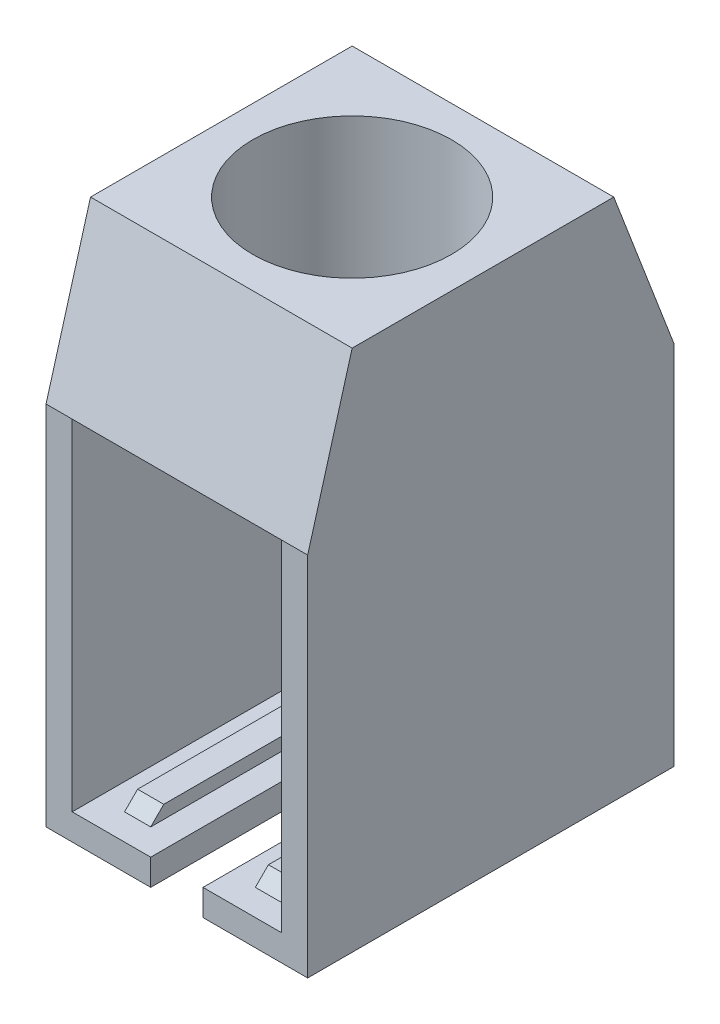
ISO-10303-21;
HEADER;
FILE_DESCRIPTION(('STEP AP214'),'2;1');
FILE_NAME('part.step','',(''),(''),'','','');
FILE_SCHEMA(('AUTOMOTIVE_DESIGN { 1 0 10303 214 1 1 1 1 }'));
ENDSEC;
DATA;
#1=APPLICATION_CONTEXT('core data for automotive mechanical design processes');
#2=APPLICATION_PROTOCOL_DEFINITION('international standard','automotive_design',2000,#1);
#3=PRODUCT_CONTEXT('',#1,'mechanical');
#4=PRODUCT('Part','Part','',(#3));
#5=PRODUCT_RELATED_PRODUCT_CATEGORY('part','',(#4));
#6=PRODUCT_DEFINITION_FORMATION('','',#4);
#7=PRODUCT_DEFINITION_CONTEXT('part definition',#1,'design');
#8=PRODUCT_DEFINITION('design','',#6,#7);
#9=PRODUCT_DEFINITION_SHAPE('','',#8);
#10=(LENGTH_UNIT() NAMED_UNIT(*) SI_UNIT(.MILLI.,.METRE.));
#11=(NAMED_UNIT(*) PLANE_ANGLE_UNIT() SI_UNIT($,.RADIAN.));
#12=(NAMED_UNIT(*) SI_UNIT($,.STERADIAN.) SOLID_ANGLE_UNIT());
#13=UNCERTAINTY_MEASURE_WITH_UNIT(LENGTH_MEASURE(1.E-05),#10,'distance_accuracy_value','');
#14=(GEOMETRIC_REPRESENTATION_CONTEXT(3) GLOBAL_UNCERTAINTY_ASSIGNED_CONTEXT((#13)) GLOBAL_UNIT_ASSIGNED_CONTEXT((#10,
#11,#12)) REPRESENTATION_CONTEXT('',''));
#15=CARTESIAN_POINT('',(0.,0.,0.));
#16=DIRECTION('',(0.,0.,1.));
#17=DIRECTION('',(1.,0.,0.));
#18=AXIS2_PLACEMENT_3D('',#15,#16,#17);
#19=CARTESIAN_POINT('',(2.5,10.,3.5));
#20=DIRECTION('',(0.,0.,-1.));
#21=DIRECTION('',(-1.,0.,0.));
#22=AXIS2_PLACEMENT_3D('',#19,#20,#21);
#23=PLANE('',#22);
#24=DIRECTION('',(0.,-1.,0.));
#25=VECTOR('',#24,1.);
#26=CARTESIAN_POINT('',(-2.,6.5,3.5));
#27=LINE('',#26,#25);
#28=CARTESIAN_POINT('',(-2.,7.,3.5));
#29=VERTEX_POINT('',#28);
#30=CARTESIAN_POINT('',(-2.,0.5,3.5));
#31=VERTEX_POINT('',#30);
#32=EDGE_CURVE('E68',#29,#31,#27,.T.);
#33=ORIENTED_EDGE('',*,*,#32,.F.);
#34=DIRECTION('',(1.,0.,0.));
#35=VECTOR('',#34,1.);
#36=CARTESIAN_POINT('',(-2.5,7.,3.5));
#37=LINE('',#36,#35);
#38=CARTESIAN_POINT('',(-2.5,7.,3.5));
#39=VERTEX_POINT('',#38);
#40=EDGE_CURVE('E331',#39,#29,#37,.T.);
#41=ORIENTED_EDGE('',*,*,#40,.F.);
#42=DIRECTION('',(0.,-1.,0.));
#43=VECTOR('',#42,1.);
#44=CARTESIAN_POINT('',(-2.5,10.,3.5));
#45=LINE('',#44,#43);
#46=CARTESIAN_POINT('',(-2.5,0.,3.5));
#47=VERTEX_POINT('',#46);
#48=EDGE_CURVE('E368',#39,#47,#45,.T.);
#49=ORIENTED_EDGE('',*,*,#48,.T.);
#50=DIRECTION('',(1.,0.,0.));
#51=VECTOR('',#50,1.);
#52=CARTESIAN_POINT('',(2.5,0.,3.5));
#53=LINE('',#52,#51);
#54=CARTESIAN_POINT('',(-0.5,0.,3.5));
#55=VERTEX_POINT('',#54);
#56=EDGE_CURVE('E354',#47,#55,#53,.T.);
#57=ORIENTED_EDGE('',*,*,#56,.T.);
#58=DIRECTION('',(0.,-1.,0.));
#59=VECTOR('',#58,1.);
#60=CARTESIAN_POINT('',(-0.5,10.001,3.5));
#61=LINE('',#60,#59);
#62=CARTESIAN_POINT('',(-0.5,0.5,3.5));
#63=VERTEX_POINT('',#62);
#64=EDGE_CURVE('E263',#63,#55,#61,.T.);
#65=ORIENTED_EDGE('',*,*,#64,.F.);
#66=DIRECTION('',(1.,0.,0.));
#67=VECTOR('',#66,1.);
#68=CARTESIAN_POINT('',(-2.,0.5,3.5));
#69=LINE('',#68,#67);
#70=EDGE_CURVE('E306',#31,#63,#69,.T.);
#71=ORIENTED_EDGE('',*,*,#70,.F.);
#72=EDGE_LOOP('',(#33,#41,#49,#57,#65,#71));
#73=FACE_BOUND('',#72,.T.);
#74=ADVANCED_FACE('F45',(#73),#23,.F.);
#75=CARTESIAN_POINT('',(-2.,0.5,-10.711102550928));
#76=DIRECTION('',(0.,-1.,0.));
#77=DIRECTION('',(0.,0.,-1.));
#78=AXIS2_PLACEMENT_3D('',#75,#76,#77);
#79=PLANE('',#78);
#80=DIRECTION('',(-1.,0.,0.));
#81=VECTOR('',#80,1.);
#82=CARTESIAN_POINT('',(-2.,0.5,-3.));
#83=LINE('',#82,#81);
#84=CARTESIAN_POINT('',(2.,0.5,-3.));
#85=VERTEX_POINT('',#84);
#86=CARTESIAN_POINT('',(1.5,0.5,-3.));
#87=VERTEX_POINT('',#86);
#88=EDGE_CURVE('E297',#85,#87,#83,.T.);
#89=ORIENTED_EDGE('',*,*,#88,.T.);
#90=DIRECTION('',(0.,0.,1.));
#91=VECTOR('',#90,1.);
#92=CARTESIAN_POINT('',(1.5,0.5,0.));
#93=LINE('',#92,#91);
#94=CARTESIAN_POINT('',(1.5,0.5,3.));
#95=VERTEX_POINT('',#94);
#96=EDGE_CURVE('E234',#87,#95,#93,.T.);
#97=ORIENTED_EDGE('',*,*,#96,.T.);
#98=DIRECTION('',(1.,0.,0.));
#99=VECTOR('',#98,1.);
#100=CARTESIAN_POINT('',(0.,0.5,3.));
#101=LINE('',#100,#99);
#102=CARTESIAN_POINT('',(0.999999999999999,0.5,3.));
#103=VERTEX_POINT('',#102);
#104=EDGE_CURVE('E231',#103,#95,#101,.T.);
#105=ORIENTED_EDGE('',*,*,#104,.F.);
#106=DIRECTION('',(0.,0.,1.));
#107=VECTOR('',#106,1.);
#108=CARTESIAN_POINT('',(0.999999999999999,0.5,0.));
#109=LINE('',#108,#107);
#110=CARTESIAN_POINT('',(0.999999999999999,0.5,-3.));
#111=VERTEX_POINT('',#110);
#112=EDGE_CURVE('E237',#111,#103,#109,.T.);
#113=ORIENTED_EDGE('',*,*,#112,.F.);
#114=CARTESIAN_POINT('',(-0.999999999999999,0.5,-3.));
#115=VERTEX_POINT('',#114);
#116=EDGE_CURVE('E209',#111,#115,#83,.T.);
#117=ORIENTED_EDGE('',*,*,#116,.T.);
#118=DIRECTION('',(0.,0.,1.));
#119=VECTOR('',#118,1.);
#120=CARTESIAN_POINT('',(-0.999999999999999,0.5,0.));
#121=LINE('',#120,#119);
#122=CARTESIAN_POINT('',(-1.,0.5,3.));
#123=VERTEX_POINT('',#122);
#124=EDGE_CURVE('E245',#115,#123,#121,.T.);
#125=ORIENTED_EDGE('',*,*,#124,.T.);
#126=DIRECTION('',(1.,0.,0.));
#127=VECTOR('',#126,1.);
#128=CARTESIAN_POINT('',(0.,0.5,3.00000000000003));
#129=LINE('',#128,#127);
#130=CARTESIAN_POINT('',(-1.5,0.5,2.99999999999999));
#131=VERTEX_POINT('',#130);
#132=EDGE_CURVE('E254',#131,#123,#129,.T.);
#133=ORIENTED_EDGE('',*,*,#132,.F.);
#134=DIRECTION('',(0.,0.,1.));
#135=VECTOR('',#134,1.);
#136=CARTESIAN_POINT('',(-1.5,0.5,0.));
#137=LINE('',#136,#135);
#138=CARTESIAN_POINT('',(-1.5,0.5,-3.));
#139=VERTEX_POINT('',#138);
#140=EDGE_CURVE('E240',#139,#131,#137,.T.);
#141=ORIENTED_EDGE('',*,*,#140,.F.);
#142=CARTESIAN_POINT('',(-2.,0.5,-3.));
#143=VERTEX_POINT('',#142);
#144=EDGE_CURVE('E295',#139,#143,#83,.T.);
#145=ORIENTED_EDGE('',*,*,#144,.T.);
#146=DIRECTION('',(0.,0.,1.));
#147=VECTOR('',#146,1.);
#148=CARTESIAN_POINT('',(-2.,0.5,-10.711102550928));
#149=LINE('',#148,#147);
#150=EDGE_CURVE('E311',#143,#31,#149,.T.);
#151=ORIENTED_EDGE('',*,*,#150,.T.);
#152=ORIENTED_EDGE('',*,*,#70,.T.);
#153=DIRECTION('',(0.,0.,1.));
#154=VECTOR('',#153,1.);
#155=CARTESIAN_POINT('',(-0.5,0.5,3.5));
#156=LINE('',#155,#154);
#157=CARTESIAN_POINT('',(-0.5,0.5,0.149999999999999));
#158=VERTEX_POINT('',#157);
#159=EDGE_CURVE('E264',#158,#63,#156,.T.);
#160=ORIENTED_EDGE('',*,*,#159,.F.);
#161=CARTESIAN_POINT('',(0.,0.5,0.15));
#162=DIRECTION('',(0.,-1.,0.));
#163=DIRECTION('',(0.,0.,-1.));
#164=AXIS2_PLACEMENT_3D('',#161,#162,#163);
#165=CIRCLE('',#164,0.5);
#166=CARTESIAN_POINT('',(0.5,0.5,0.15));
#167=VERTEX_POINT('',#166);
#168=EDGE_CURVE('E267',#167,#158,#165,.F.);
#169=ORIENTED_EDGE('',*,*,#168,.F.);
#170=DIRECTION('',(0.,0.,-1.));
#171=VECTOR('',#170,1.);
#172=CARTESIAN_POINT('',(0.5,0.5,0.15));
#173=LINE('',#172,#171);
#174=CARTESIAN_POINT('',(0.5,0.5,3.5));
#175=VERTEX_POINT('',#174);
#176=EDGE_CURVE('E276',#175,#167,#173,.T.);
#177=ORIENTED_EDGE('',*,*,#176,.F.);
#178=CARTESIAN_POINT('',(2.,0.5,3.5));
#179=VERTEX_POINT('',#178);
#180=EDGE_CURVE('E305',#175,#179,#69,.T.);
#181=ORIENTED_EDGE('',*,*,#180,.T.);
#182=DIRECTION('',(0.,0.,1.));
#183=VECTOR('',#182,1.);
#184=CARTESIAN_POINT('',(2.,0.5,-10.711102550928));
#185=LINE('',#184,#183);
#186=EDGE_CURVE('E296',#85,#179,#185,.T.);
#187=ORIENTED_EDGE('',*,*,#186,.F.);
#188=EDGE_LOOP('',(#89,#97,#105,#113,#117,#125,#133,#141,#145,#151,#152,#160,#169,#177,#181,#187));
#189=FACE_BOUND('',#188,.T.);
#190=ADVANCED_FACE('F437',(#189),#79,.F.);
#191=CARTESIAN_POINT('',(2.5,10.,-3.));
#192=DIRECTION('',(0.,0.,1.));
#193=DIRECTION('',(1.,0.,0.));
#194=AXIS2_PLACEMENT_3D('',#191,#192,#193);
#195=PLANE('',#194);
#196=DIRECTION('',(0.,-1.,0.));
#197=VECTOR('',#196,1.);
#198=CARTESIAN_POINT('',(1.5,0.75,-3.));
#199=LINE('',#198,#197);
#200=CARTESIAN_POINT('',(1.5,0.750000000000001,-3.));
#201=VERTEX_POINT('',#200);
#202=EDGE_CURVE('E213',#201,#87,#199,.T.);
#203=ORIENTED_EDGE('',*,*,#202,.T.);
#204=ORIENTED_EDGE('',*,*,#88,.F.);
#205=DIRECTION('',(0.,-1.,0.));
#206=VECTOR('',#205,1.);
#207=CARTESIAN_POINT('',(2.,6.5,-3.));
#208=LINE('',#207,#206);
#209=CARTESIAN_POINT('',(2.,6.5,-3.));
#210=VERTEX_POINT('',#209);
#211=EDGE_CURVE('E300',#210,#85,#208,.T.);
#212=ORIENTED_EDGE('',*,*,#211,.F.);
#213=DIRECTION('',(1.,0.,0.));
#214=VECTOR('',#213,1.);
#215=CARTESIAN_POINT('',(-2.,6.5,-3.));
#216=LINE('',#215,#214);
#217=CARTESIAN_POINT('',(-2.,6.5,-3.));
#218=VERTEX_POINT('',#217);
#219=EDGE_CURVE('E302',#218,#210,#216,.T.);
#220=ORIENTED_EDGE('',*,*,#219,.F.);
#221=DIRECTION('',(0.,1.,0.));
#222=VECTOR('',#221,1.);
#223=CARTESIAN_POINT('',(-2.,6.5,-3.));
#224=LINE('',#223,#222);
#225=EDGE_CURVE('E293',#143,#218,#224,.T.);
#226=ORIENTED_EDGE('',*,*,#225,.F.);
#227=ORIENTED_EDGE('',*,*,#144,.F.);
#228=DIRECTION('',(0.,-1.,0.));
#229=VECTOR('',#228,1.);
#230=CARTESIAN_POINT('',(-1.5,0.75,-3.));
#231=LINE('',#230,#229);
#232=CARTESIAN_POINT('',(-1.5,0.75,-3.));
#233=VERTEX_POINT('',#232);
#234=EDGE_CURVE('E251',#233,#139,#231,.T.);
#235=ORIENTED_EDGE('',*,*,#234,.F.);
#236=DIRECTION('',(-1.,0.,0.));
#237=VECTOR('',#236,1.);
#238=CARTESIAN_POINT('',(0.,0.75,-3.));
#239=LINE('',#238,#237);
#240=CARTESIAN_POINT('',(-0.999999999999999,0.750000000000001,-3.));
#241=VERTEX_POINT('',#240);
#242=EDGE_CURVE('E248',#241,#233,#239,.T.);
#243=ORIENTED_EDGE('',*,*,#242,.F.);
#244=DIRECTION('',(0.,-1.,0.));
#245=VECTOR('',#244,1.);
#246=CARTESIAN_POINT('',(-0.999999999999999,0.75,-3.));
#247=LINE('',#246,#245);
#248=EDGE_CURVE('E261',#241,#115,#247,.T.);
#249=ORIENTED_EDGE('',*,*,#248,.T.);
#250=ORIENTED_EDGE('',*,*,#116,.F.);
#251=DIRECTION('',(0.,-1.,0.));
#252=VECTOR('',#251,1.);
#253=CARTESIAN_POINT('',(0.999999999999999,0.75,-3.));
#254=LINE('',#253,#252);
#255=CARTESIAN_POINT('',(0.999999999999999,0.75,-3.));
#256=VERTEX_POINT('',#255);
#257=EDGE_CURVE('E203',#256,#111,#254,.T.);
#258=ORIENTED_EDGE('',*,*,#257,.F.);
#259=DIRECTION('',(-1.,0.,0.));
#260=VECTOR('',#259,1.);
#261=CARTESIAN_POINT('',(0.,0.75,-3.));
#262=LINE('',#261,#260);
#263=EDGE_CURVE('E206',#201,#256,#262,.T.);
#264=ORIENTED_EDGE('',*,*,#263,.F.);
#265=EDGE_LOOP('',(#203,#204,#212,#220,#226,#227,#235,#243,#249,#250,#258,#264));
#266=FACE_BOUND('',#265,.T.);
#267=ADVANCED_FACE('F205',(#266),#195,.T.);
#268=CARTESIAN_POINT('',(-2.5,10.,-3.5));
#269=DIRECTION('',(1.,0.,0.));
#270=DIRECTION('',(0.,0.,-1.));
#271=AXIS2_PLACEMENT_3D('',#268,#269,#270);
#272=PLANE('',#271);
#273=ORIENTED_EDGE('',*,*,#48,.F.);
#274=DIRECTION('',(0.,0.962126726315384,-0.272602572456025));
#275=VECTOR('',#274,1.);
#276=CARTESIAN_POINT('',(-2.5,7.,3.5));
#277=LINE('',#276,#275);
#278=CARTESIAN_POINT('',(-2.5,10.,2.65));
#279=VERTEX_POINT('',#278);
#280=EDGE_CURVE('E320',#39,#279,#277,.T.);
#281=ORIENTED_EDGE('',*,*,#280,.T.);
#282=DIRECTION('',(0.,0.,1.));
#283=VECTOR('',#282,1.);
#284=CARTESIAN_POINT('',(-2.5,10.,-3.5));
#285=LINE('',#284,#283);
#286=CARTESIAN_POINT('',(-2.5,10.,-2.35));
#287=VERTEX_POINT('',#286);
#288=EDGE_CURVE('E343',#287,#279,#285,.T.);
#289=ORIENTED_EDGE('',*,*,#288,.F.);
#290=DIRECTION('',(0.,-0.93374611730205,-0.357936011632452));
#291=VECTOR('',#290,1.);
#292=CARTESIAN_POINT('',(-2.5,7.,-3.5));
#293=LINE('',#292,#291);
#294=CARTESIAN_POINT('',(-2.5,7.,-3.5));
#295=VERTEX_POINT('',#294);
#296=EDGE_CURVE('E338',#287,#295,#293,.T.);
#297=ORIENTED_EDGE('',*,*,#296,.T.);
#298=DIRECTION('',(0.,-1.,0.));
#299=VECTOR('',#298,1.);
#300=CARTESIAN_POINT('',(-2.5,10.,-3.5));
#301=LINE('',#300,#299);
#302=CARTESIAN_POINT('',(-2.5,0.,-3.5));
#303=VERTEX_POINT('',#302);
#304=EDGE_CURVE('E350',#295,#303,#301,.T.);
#305=ORIENTED_EDGE('',*,*,#304,.T.);
#306=DIRECTION('',(0.,0.,1.));
#307=VECTOR('',#306,1.);
#308=CARTESIAN_POINT('',(-2.5,0.,-3.5));
#309=LINE('',#308,#307);
#310=EDGE_CURVE('E330',#303,#47,#309,.T.);
#311=ORIENTED_EDGE('',*,*,#310,.T.);
#312=EDGE_LOOP('',(#273,#281,#289,#297,#305,#311));
#313=FACE_BOUND('',#312,.T.);
#314=ADVANCED_FACE('F422',(#313),#272,.F.);
#315=CARTESIAN_POINT('',(2.,7.,3.5));
#316=VERTEX_POINT('',#315);
#317=CARTESIAN_POINT('',(2.5,7.,3.5));
#318=VERTEX_POINT('',#317);
#319=EDGE_CURVE('E323',#316,#318,#37,.T.);
#320=ORIENTED_EDGE('',*,*,#319,.F.);
#321=DIRECTION('',(0.,1.,0.));
#322=VECTOR('',#321,1.);
#323=CARTESIAN_POINT('',(2.,6.5,3.5));
#324=LINE('',#323,#322);
#325=EDGE_CURVE('E60',#179,#316,#324,.T.);
#326=ORIENTED_EDGE('',*,*,#325,.F.);
#327=ORIENTED_EDGE('',*,*,#180,.F.);
#328=DIRECTION('',(0.,-1.,0.));
#329=VECTOR('',#328,1.);
#330=CARTESIAN_POINT('',(0.5,10.001,3.5));
#331=LINE('',#330,#329);
#332=CARTESIAN_POINT('',(0.5,0.,3.5));
#333=VERTEX_POINT('',#332);
#334=EDGE_CURVE('E273',#175,#333,#331,.T.);
#335=ORIENTED_EDGE('',*,*,#334,.T.);
#336=CARTESIAN_POINT('',(2.5,0.,3.5));
#337=VERTEX_POINT('',#336);
#338=EDGE_CURVE('E353',#333,#337,#53,.T.);
#339=ORIENTED_EDGE('',*,*,#338,.T.);
#340=DIRECTION('',(0.,-1.,0.));
#341=VECTOR('',#340,1.);
#342=CARTESIAN_POINT('',(2.5,10.,3.5));
#343=LINE('',#342,#341);
#344=EDGE_CURVE('E365',#318,#337,#343,.T.);
#345=ORIENTED_EDGE('',*,*,#344,.F.);
#346=EDGE_LOOP('',(#320,#326,#327,#335,#339,#345));
#347=FACE_BOUND('',#346,.T.);
#348=ADVANCED_FACE('F404',(#347),#23,.F.);
#349=CARTESIAN_POINT('',(2.5,10.,-3.5));
#350=DIRECTION('',(-1.,0.,0.));
#351=DIRECTION('',(0.,0.,1.));
#352=AXIS2_PLACEMENT_3D('',#349,#350,#351);
#353=PLANE('',#352);
#354=DIRECTION('',(0.,0.,-1.));
#355=VECTOR('',#354,1.);
#356=CARTESIAN_POINT('',(2.5,10.,-3.5));
#357=LINE('',#356,#355);
#358=CARTESIAN_POINT('',(2.5,10.,2.65));
#359=VERTEX_POINT('',#358);
#360=CARTESIAN_POINT('',(2.5,10.,-2.35));
#361=VERTEX_POINT('',#360);
#362=EDGE_CURVE('E346',#359,#361,#357,.T.);
#363=ORIENTED_EDGE('',*,*,#362,.F.);
#364=DIRECTION('',(0.,0.962126726315384,-0.272602572456025));
#365=VECTOR('',#364,1.);
#366=CARTESIAN_POINT('',(2.5,7.,3.5));
#367=LINE('',#366,#365);
#368=EDGE_CURVE('E324',#318,#359,#367,.T.);
#369=ORIENTED_EDGE('',*,*,#368,.F.);
#370=ORIENTED_EDGE('',*,*,#344,.T.);
#371=DIRECTION('',(0.,0.,-1.));
#372=VECTOR('',#371,1.);
#373=CARTESIAN_POINT('',(2.5,0.,-3.5));
#374=LINE('',#373,#372);
#375=CARTESIAN_POINT('',(2.5,0.,-3.5));
#376=VERTEX_POINT('',#375);
#377=EDGE_CURVE('E357',#337,#376,#374,.T.);
#378=ORIENTED_EDGE('',*,*,#377,.T.);
#379=DIRECTION('',(0.,-1.,0.));
#380=VECTOR('',#379,1.);
#381=CARTESIAN_POINT('',(2.5,10.,-3.5));
#382=LINE('',#381,#380);
#383=CARTESIAN_POINT('',(2.5,7.,-3.5));
#384=VERTEX_POINT('',#383);
#385=EDGE_CURVE('E363',#384,#376,#382,.T.);
#386=ORIENTED_EDGE('',*,*,#385,.F.);
#387=DIRECTION('',(0.,-0.93374611730205,-0.357936011632452));
#388=VECTOR('',#387,1.);
#389=CARTESIAN_POINT('',(2.5,7.,-3.5));
#390=LINE('',#389,#388);
#391=EDGE_CURVE('E326',#361,#384,#390,.T.);
#392=ORIENTED_EDGE('',*,*,#391,.F.);
#393=EDGE_LOOP('',(#363,#369,#370,#378,#386,#392));
#394=FACE_BOUND('',#393,.T.);
#395=ADVANCED_FACE('F401',(#394),#353,.F.);
#396=CARTESIAN_POINT('',(2.5,10.,-3.5));
#397=DIRECTION('',(0.,0.,1.));
#398=DIRECTION('',(1.,0.,0.));
#399=AXIS2_PLACEMENT_3D('',#396,#397,#398);
#400=PLANE('',#399);
#401=ORIENTED_EDGE('',*,*,#304,.F.);
#402=DIRECTION('',(1.,0.,0.));
#403=VECTOR('',#402,1.);
#404=CARTESIAN_POINT('',(-2.5,7.,-3.5));
#405=LINE('',#404,#403);
#406=EDGE_CURVE('E335',#295,#384,#405,.T.);
#407=ORIENTED_EDGE('',*,*,#406,.T.);
#408=ORIENTED_EDGE('',*,*,#385,.T.);
#409=DIRECTION('',(-1.,0.,0.));
#410=VECTOR('',#409,1.);
#411=CARTESIAN_POINT('',(2.5,0.,-3.5));
#412=LINE('',#411,#410);
#413=EDGE_CURVE('E347',#376,#303,#412,.T.);
#414=ORIENTED_EDGE('',*,*,#413,.T.);
#415=EDGE_LOOP('',(#401,#407,#408,#414));
#416=FACE_BOUND('',#415,.T.);
#417=ADVANCED_FACE('F416',(#416),#400,.F.);
#418=CARTESIAN_POINT('',(0.,10.,0.));
#419=DIRECTION('',(0.,-1.,0.));
#420=DIRECTION('',(0.,0.,-1.));
#421=AXIS2_PLACEMENT_3D('',#418,#419,#420);
#422=PLANE('',#421);
#423=CARTESIAN_POINT('',(0.,10.,0.15));
#424=DIRECTION('',(0.,1.,0.));
#425=DIRECTION('',(0.,0.,1.));
#426=AXIS2_PLACEMENT_3D('',#423,#424,#425);
#427=CIRCLE('',#426,1.9);
#428=CARTESIAN_POINT('',(0.,10.,2.05));
#429=VERTEX_POINT('',#428);
#430=EDGE_CURVE('E290',#429,#429,#427,.T.);
#431=ORIENTED_EDGE('',*,*,#430,.F.);
#432=EDGE_LOOP('',(#431));
#433=FACE_BOUND('',#432,.T.);
#434=ORIENTED_EDGE('',*,*,#288,.T.);
#435=DIRECTION('',(1.,0.,0.));
#436=VECTOR('',#435,1.);
#437=CARTESIAN_POINT('',(-2.5,10.,2.65));
#438=LINE('',#437,#436);
#439=EDGE_CURVE('E327',#279,#359,#438,.T.);
#440=ORIENTED_EDGE('',*,*,#439,.T.);
#441=ORIENTED_EDGE('',*,*,#362,.T.);
#442=DIRECTION('',(1.,0.,0.));
#443=VECTOR('',#442,1.);
#444=CARTESIAN_POINT('',(-2.5,10.,-2.35));
#445=LINE('',#444,#443);
#446=EDGE_CURVE('E319',#287,#361,#445,.T.);
#447=ORIENTED_EDGE('',*,*,#446,.F.);
#448=EDGE_LOOP('',(#434,#440,#441,#447));
#449=FACE_BOUND('',#448,.T.);
#450=ADVANCED_FACE('F424',(#433,#449),#422,.F.);
#451=CARTESIAN_POINT('',(0.,0.,0.));
#452=DIRECTION('',(0.,-1.,0.));
#453=DIRECTION('',(0.,0.,-1.));
#454=AXIS2_PLACEMENT_3D('',#451,#452,#453);
#455=PLANE('',#454);
#456=DIRECTION('',(0.,0.,1.));
#457=VECTOR('',#456,1.);
#458=CARTESIAN_POINT('',(0.5,0.,0.15));
#459=LINE('',#458,#457);
#460=CARTESIAN_POINT('',(0.5,0.,0.15));
#461=VERTEX_POINT('',#460);
#462=EDGE_CURVE('E274',#461,#333,#459,.T.);
#463=ORIENTED_EDGE('',*,*,#462,.F.);
#464=CARTESIAN_POINT('',(0.,0.,0.15));
#465=DIRECTION('',(0.,-1.,0.));
#466=DIRECTION('',(0.,0.,-1.));
#467=AXIS2_PLACEMENT_3D('',#464,#465,#466);
#468=CIRCLE('',#467,0.5);
#469=CARTESIAN_POINT('',(-0.5,0.,0.15));
#470=VERTEX_POINT('',#469);
#471=EDGE_CURVE('E277',#470,#461,#468,.T.);
#472=ORIENTED_EDGE('',*,*,#471,.F.);
#473=DIRECTION('',(0.,0.,-1.));
#474=VECTOR('',#473,1.);
#475=CARTESIAN_POINT('',(-0.5,0.,3.5));
#476=LINE('',#475,#474);
#477=EDGE_CURVE('E270',#55,#470,#476,.T.);
#478=ORIENTED_EDGE('',*,*,#477,.F.);
#479=ORIENTED_EDGE('',*,*,#56,.F.);
#480=ORIENTED_EDGE('',*,*,#310,.F.);
#481=ORIENTED_EDGE('',*,*,#413,.F.);
#482=ORIENTED_EDGE('',*,*,#377,.F.);
#483=ORIENTED_EDGE('',*,*,#338,.F.);
#484=EDGE_LOOP('',(#463,#472,#478,#479,#480,#481,#482,#483));
#485=FACE_BOUND('',#484,.T.);
#486=ADVANCED_FACE('F409',(#485),#455,.T.);
#487=CARTESIAN_POINT('',(-2.5,7.,-3.5));
#488=DIRECTION('',(0.,-0.357936011632452,0.93374611730205));
#489=DIRECTION('',(0.,-0.93374611730205,-0.357936011632452));
#490=AXIS2_PLACEMENT_3D('',#487,#488,#489);
#491=PLANE('',#490);
#492=ORIENTED_EDGE('',*,*,#391,.T.);
#493=ORIENTED_EDGE('',*,*,#406,.F.);
#494=ORIENTED_EDGE('',*,*,#296,.F.);
#495=ORIENTED_EDGE('',*,*,#446,.T.);
#496=EDGE_LOOP('',(#492,#493,#494,#495));
#497=FACE_BOUND('',#496,.T.);
#498=ADVANCED_FACE('F418',(#497),#491,.F.);
#499=CARTESIAN_POINT('',(-2.5,7.,3.5));
#500=DIRECTION('',(0.,-0.272602572456025,-0.962126726315384));
#501=DIRECTION('',(0.,0.962126726315384,-0.272602572456025));
#502=AXIS2_PLACEMENT_3D('',#499,#500,#501);
#503=PLANE('',#502);
#504=ORIENTED_EDGE('',*,*,#368,.T.);
#505=ORIENTED_EDGE('',*,*,#439,.F.);
#506=ORIENTED_EDGE('',*,*,#280,.F.);
#507=ORIENTED_EDGE('',*,*,#40,.T.);
#508=EDGE_CURVE('E334',#29,#316,#37,.T.);
#509=ORIENTED_EDGE('',*,*,#508,.T.);
#510=ORIENTED_EDGE('',*,*,#319,.T.);
#511=EDGE_LOOP('',(#504,#505,#506,#507,#509,#510));
#512=FACE_BOUND('',#511,.T.);
#513=ADVANCED_FACE('F393',(#512),#503,.F.);
#514=CARTESIAN_POINT('',(2.,6.5,-10.711102550928));
#515=DIRECTION('',(1.,0.,0.));
#516=DIRECTION('',(0.,0.,-1.));
#517=AXIS2_PLACEMENT_3D('',#514,#515,#516);
#518=PLANE('',#517);
#519=ORIENTED_EDGE('',*,*,#211,.T.);
#520=ORIENTED_EDGE('',*,*,#186,.T.);
#521=ORIENTED_EDGE('',*,*,#325,.T.);
#522=DIRECTION('',(0.,0.707106781186547,0.707106781186548));
#523=VECTOR('',#522,1.);
#524=CARTESIAN_POINT('',(2.,-0.355551275463988,-3.855551275464));
#525=LINE('',#524,#523);
#526=CARTESIAN_POINT('',(2.,6.5,3.));
#527=VERTEX_POINT('',#526);
#528=EDGE_CURVE('E12',#316,#527,#525,.F.);
#529=ORIENTED_EDGE('',*,*,#528,.T.);
#530=DIRECTION('',(0.,0.,1.));
#531=VECTOR('',#530,1.);
#532=CARTESIAN_POINT('',(2.,6.5,-10.711102550928));
#533=LINE('',#532,#531);
#534=EDGE_CURVE('E309',#210,#527,#533,.T.);
#535=ORIENTED_EDGE('',*,*,#534,.F.);
#536=EDGE_LOOP('',(#519,#520,#521,#529,#535));
#537=FACE_BOUND('',#536,.T.);
#538=ADVANCED_FACE('F490',(#537),#518,.F.);
#539=CARTESIAN_POINT('',(-2.,6.5,-10.711102550928));
#540=DIRECTION('',(-1.,0.,0.));
#541=DIRECTION('',(0.,0.,1.));
#542=AXIS2_PLACEMENT_3D('',#539,#540,#541);
#543=PLANE('',#542);
#544=ORIENTED_EDGE('',*,*,#225,.T.);
#545=DIRECTION('',(0.,0.,1.));
#546=VECTOR('',#545,1.);
#547=CARTESIAN_POINT('',(-2.,6.5,-10.711102550928));
#548=LINE('',#547,#546);
#549=CARTESIAN_POINT('',(-2.,6.5,3.));
#550=VERTEX_POINT('',#549);
#551=EDGE_CURVE('E313',#218,#550,#548,.T.);
#552=ORIENTED_EDGE('',*,*,#551,.T.);
#553=DIRECTION('',(0.,-0.707106781186547,-0.707106781186548));
#554=VECTOR('',#553,1.);
#555=CARTESIAN_POINT('',(-2.,-0.355551275463988,-3.855551275464));
#556=LINE('',#555,#554);
#557=EDGE_CURVE('E54',#550,#29,#556,.F.);
#558=ORIENTED_EDGE('',*,*,#557,.T.);
#559=ORIENTED_EDGE('',*,*,#32,.T.);
#560=ORIENTED_EDGE('',*,*,#150,.F.);
#561=EDGE_LOOP('',(#544,#552,#558,#559,#560));
#562=FACE_BOUND('',#561,.T.);
#563=ADVANCED_FACE('F385',(#562),#543,.F.);
#564=CARTESIAN_POINT('',(-2.,6.5,-10.711102550928));
#565=DIRECTION('',(0.,1.,0.));
#566=DIRECTION('',(0.,0.,1.));
#567=AXIS2_PLACEMENT_3D('',#564,#565,#566);
#568=PLANE('',#567);
#569=CARTESIAN_POINT('',(0.,6.5,0.15));
#570=DIRECTION('',(0.,1.,0.));
#571=DIRECTION('',(0.,0.,1.));
#572=AXIS2_PLACEMENT_3D('',#569,#570,#571);
#573=CIRCLE('',#572,1.9);
#574=CARTESIAN_POINT('',(0.,6.5,2.05));
#575=VERTEX_POINT('',#574);
#576=EDGE_CURVE('E266',#575,#575,#573,.F.);
#577=ORIENTED_EDGE('',*,*,#576,.F.);
#578=EDGE_LOOP('',(#577));
#579=FACE_BOUND('',#578,.T.);
#580=ORIENTED_EDGE('',*,*,#534,.T.);
#581=DIRECTION('',(-1.,0.,0.));
#582=VECTOR('',#581,1.);
#583=CARTESIAN_POINT('',(-2.,6.5,3.));
#584=LINE('',#583,#582);
#585=EDGE_CURVE('E382',#527,#550,#584,.T.);
#586=ORIENTED_EDGE('',*,*,#585,.T.);
#587=ORIENTED_EDGE('',*,*,#551,.F.);
#588=ORIENTED_EDGE('',*,*,#219,.T.);
#589=EDGE_LOOP('',(#580,#586,#587,#588));
#590=FACE_BOUND('',#589,.T.);
#591=ADVANCED_FACE('F488',(#579,#590),#568,.F.);
#592=CARTESIAN_POINT('',(0.,-0.000999999999999265,0.15));
#593=DIRECTION('',(0.,1.,0.));
#594=DIRECTION('',(0.,0.,1.));
#595=AXIS2_PLACEMENT_3D('',#592,#593,#594);
#596=CYLINDRICAL_SURFACE('',#595,1.9);
#597=ORIENTED_EDGE('',*,*,#430,.T.);
#598=EDGE_LOOP('',(#597));
#599=FACE_BOUND('',#598,.T.);
#600=ORIENTED_EDGE('',*,*,#576,.T.);
#601=EDGE_LOOP('',(#600));
#602=FACE_BOUND('',#601,.T.);
#603=ADVANCED_FACE('F517',(#599,#602),#596,.F.);
#604=CARTESIAN_POINT('',(0.5,10.001,0.15));
#605=DIRECTION('',(1.,0.,0.));
#606=DIRECTION('',(0.,0.,-1.));
#607=AXIS2_PLACEMENT_3D('',#604,#605,#606);
#608=PLANE('',#607);
#609=ORIENTED_EDGE('',*,*,#176,.T.);
#610=DIRECTION('',(0.,-1.,0.));
#611=VECTOR('',#610,1.);
#612=CARTESIAN_POINT('',(0.5,10.001,0.15));
#613=LINE('',#612,#611);
#614=EDGE_CURVE('E271',#167,#461,#613,.T.);
#615=ORIENTED_EDGE('',*,*,#614,.T.);
#616=ORIENTED_EDGE('',*,*,#462,.T.);
#617=ORIENTED_EDGE('',*,*,#334,.F.);
#618=EDGE_LOOP('',(#609,#615,#616,#617));
#619=FACE_BOUND('',#618,.T.);
#620=ADVANCED_FACE('F498',(#619),#608,.F.);
#621=CARTESIAN_POINT('',(0.,10.001,0.15));
#622=DIRECTION('',(0.,-1.,0.));
#623=DIRECTION('',(0.,0.,-1.));
#624=AXIS2_PLACEMENT_3D('',#621,#622,#623);
#625=CYLINDRICAL_SURFACE('',#624,0.5);
#626=ORIENTED_EDGE('',*,*,#168,.T.);
#627=DIRECTION('',(0.,-1.,0.));
#628=VECTOR('',#627,1.);
#629=CARTESIAN_POINT('',(-0.5,10.001,0.15));
#630=LINE('',#629,#628);
#631=EDGE_CURVE('E268',#158,#470,#630,.T.);
#632=ORIENTED_EDGE('',*,*,#631,.T.);
#633=ORIENTED_EDGE('',*,*,#471,.T.);
#634=ORIENTED_EDGE('',*,*,#614,.F.);
#635=EDGE_LOOP('',(#626,#632,#633,#634));
#636=FACE_BOUND('',#635,.T.);
#637=ADVANCED_FACE('F500',(#636),#625,.F.);
#638=CARTESIAN_POINT('',(-0.5,10.001,3.5));
#639=DIRECTION('',(-1.,0.,0.));
#640=DIRECTION('',(0.,0.,1.));
#641=AXIS2_PLACEMENT_3D('',#638,#639,#640);
#642=PLANE('',#641);
#643=ORIENTED_EDGE('',*,*,#159,.T.);
#644=ORIENTED_EDGE('',*,*,#64,.T.);
#645=ORIENTED_EDGE('',*,*,#477,.T.);
#646=ORIENTED_EDGE('',*,*,#631,.F.);
#647=EDGE_LOOP('',(#643,#644,#645,#646));
#648=FACE_BOUND('',#647,.T.);
#649=ADVANCED_FACE('F506',(#648),#642,.F.);
#650=CARTESIAN_POINT('',(-1.5,0.75,0.));
#651=DIRECTION('',(1.,0.,0.));
#652=DIRECTION('',(0.,0.,-1.));
#653=AXIS2_PLACEMENT_3D('',#650,#651,#652);
#654=PLANE('',#653);
#655=ORIENTED_EDGE('',*,*,#140,.T.);
#656=DIRECTION('',(0.,0.70710678118655,-0.707106781186545));
#657=VECTOR('',#656,1.);
#658=CARTESIAN_POINT('',(-1.5,0.749999999999976,2.75000000000001));
#659=LINE('',#658,#657);
#660=CARTESIAN_POINT('',(-1.5,0.75,2.74999999999998));
#661=VERTEX_POINT('',#660);
#662=EDGE_CURVE('E380',#131,#661,#659,.T.);
#663=ORIENTED_EDGE('',*,*,#662,.T.);
#664=DIRECTION('',(0.,0.,1.));
#665=VECTOR('',#664,1.);
#666=CARTESIAN_POINT('',(-1.5,0.75,0.));
#667=LINE('',#666,#665);
#668=EDGE_CURVE('E241',#233,#661,#667,.T.);
#669=ORIENTED_EDGE('',*,*,#668,.F.);
#670=ORIENTED_EDGE('',*,*,#234,.T.);
#671=EDGE_LOOP('',(#655,#663,#669,#670));
#672=FACE_BOUND('',#671,.T.);
#673=ADVANCED_FACE('F475',(#672),#654,.F.);
#674=CARTESIAN_POINT('',(-0.999999999999999,0.75,0.));
#675=DIRECTION('',(1.,0.,0.));
#676=DIRECTION('',(0.,0.,-1.));
#677=AXIS2_PLACEMENT_3D('',#674,#675,#676);
#678=PLANE('',#677);
#679=DIRECTION('',(0.,0.,1.));
#680=VECTOR('',#679,1.);
#681=CARTESIAN_POINT('',(-0.999999999999999,0.75,0.));
#682=LINE('',#681,#680);
#683=CARTESIAN_POINT('',(-1.,0.75,2.75));
#684=VERTEX_POINT('',#683);
#685=EDGE_CURVE('E244',#241,#684,#682,.T.);
#686=ORIENTED_EDGE('',*,*,#685,.T.);
#687=DIRECTION('',(0.,-0.70710678118655,0.707106781186545));
#688=VECTOR('',#687,1.);
#689=CARTESIAN_POINT('',(-0.999999999999999,2.125,1.37500000000001));
#690=LINE('',#689,#688);
#691=EDGE_CURVE('E378',#684,#123,#690,.T.);
#692=ORIENTED_EDGE('',*,*,#691,.T.);
#693=ORIENTED_EDGE('',*,*,#124,.F.);
#694=ORIENTED_EDGE('',*,*,#248,.F.);
#695=EDGE_LOOP('',(#686,#692,#693,#694));
#696=FACE_BOUND('',#695,.T.);
#697=ADVANCED_FACE('F483',(#696),#678,.T.);
#698=CARTESIAN_POINT('',(0.,0.75,0.));
#699=DIRECTION('',(0.,1.,0.));
#700=DIRECTION('',(0.,0.,1.));
#701=AXIS2_PLACEMENT_3D('',#698,#699,#700);
#702=PLANE('',#701);
#703=ORIENTED_EDGE('',*,*,#668,.T.);
#704=DIRECTION('',(1.,0.,0.));
#705=VECTOR('',#704,1.);
#706=CARTESIAN_POINT('',(-0.999999999999992,0.75,2.75));
#707=LINE('',#706,#705);
#708=EDGE_CURVE('E375',#661,#684,#707,.T.);
#709=ORIENTED_EDGE('',*,*,#708,.T.);
#710=ORIENTED_EDGE('',*,*,#685,.F.);
#711=ORIENTED_EDGE('',*,*,#242,.T.);
#712=EDGE_LOOP('',(#703,#709,#710,#711));
#713=FACE_BOUND('',#712,.T.);
#714=ADVANCED_FACE('F477',(#713),#702,.T.);
#715=CARTESIAN_POINT('',(1.5,0.75,0.));
#716=DIRECTION('',(1.,0.,0.));
#717=DIRECTION('',(0.,0.,-1.));
#718=AXIS2_PLACEMENT_3D('',#715,#716,#717);
#719=PLANE('',#718);
#720=DIRECTION('',(0.,0.,1.));
#721=VECTOR('',#720,1.);
#722=CARTESIAN_POINT('',(1.5,0.75,0.));
#723=LINE('',#722,#721);
#724=CARTESIAN_POINT('',(1.5,0.75,2.75));
#725=VERTEX_POINT('',#724);
#726=EDGE_CURVE('E223',#201,#725,#723,.T.);
#727=ORIENTED_EDGE('',*,*,#726,.T.);
#728=DIRECTION('',(0.,-0.70710678118655,0.707106781186545));
#729=VECTOR('',#728,1.);
#730=CARTESIAN_POINT('',(1.5,2.125,1.37500000000001));
#731=LINE('',#730,#729);
#732=EDGE_CURVE('E372',#725,#95,#731,.T.);
#733=ORIENTED_EDGE('',*,*,#732,.T.);
#734=ORIENTED_EDGE('',*,*,#96,.F.);
#735=ORIENTED_EDGE('',*,*,#202,.F.);
#736=EDGE_LOOP('',(#727,#733,#734,#735));
#737=FACE_BOUND('',#736,.T.);
#738=ADVANCED_FACE('F592',(#737),#719,.T.);
#739=CARTESIAN_POINT('',(0.999999999999999,0.75,0.));
#740=DIRECTION('',(1.,0.,0.));
#741=DIRECTION('',(0.,0.,-1.));
#742=AXIS2_PLACEMENT_3D('',#739,#740,#741);
#743=PLANE('',#742);
#744=ORIENTED_EDGE('',*,*,#112,.T.);
#745=DIRECTION('',(0.,0.70710678118655,-0.707106781186545));
#746=VECTOR('',#745,1.);
#747=CARTESIAN_POINT('',(1.,0.75,2.75));
#748=LINE('',#747,#746);
#749=CARTESIAN_POINT('',(1.,0.75,2.75));
#750=VERTEX_POINT('',#749);
#751=EDGE_CURVE('E227',#103,#750,#748,.T.);
#752=ORIENTED_EDGE('',*,*,#751,.T.);
#753=DIRECTION('',(0.,0.,1.));
#754=VECTOR('',#753,1.);
#755=CARTESIAN_POINT('',(0.999999999999999,0.75,0.));
#756=LINE('',#755,#754);
#757=EDGE_CURVE('E214',#256,#750,#756,.T.);
#758=ORIENTED_EDGE('',*,*,#757,.F.);
#759=ORIENTED_EDGE('',*,*,#257,.T.);
#760=EDGE_LOOP('',(#744,#752,#758,#759));
#761=FACE_BOUND('',#760,.T.);
#762=ADVANCED_FACE('F225',(#761),#743,.F.);
#763=CARTESIAN_POINT('',(0.,0.75,0.));
#764=DIRECTION('',(0.,1.,0.));
#765=DIRECTION('',(0.,0.,1.));
#766=AXIS2_PLACEMENT_3D('',#763,#764,#765);
#767=PLANE('',#766);
#768=ORIENTED_EDGE('',*,*,#757,.T.);
#769=DIRECTION('',(1.,0.,0.));
#770=VECTOR('',#769,1.);
#771=CARTESIAN_POINT('',(1.5,0.75,2.75));
#772=LINE('',#771,#770);
#773=EDGE_CURVE('E370',#750,#725,#772,.T.);
#774=ORIENTED_EDGE('',*,*,#773,.T.);
#775=ORIENTED_EDGE('',*,*,#726,.F.);
#776=ORIENTED_EDGE('',*,*,#263,.T.);
#777=EDGE_LOOP('',(#768,#774,#775,#776));
#778=FACE_BOUND('',#777,.T.);
#779=ADVANCED_FACE('F219',(#778),#767,.T.);
#780=CARTESIAN_POINT('',(0.,0.75,2.75));
#781=DIRECTION('',(0.,0.707106781186545,0.70710678118655));
#782=DIRECTION('',(-1.,0.,0.));
#783=AXIS2_PLACEMENT_3D('',#780,#781,#782);
#784=PLANE('',#783);
#785=ORIENTED_EDGE('',*,*,#751,.F.);
#786=ORIENTED_EDGE('',*,*,#104,.T.);
#787=ORIENTED_EDGE('',*,*,#732,.F.);
#788=ORIENTED_EDGE('',*,*,#773,.F.);
#789=EDGE_LOOP('',(#785,#786,#787,#788));
#790=FACE_BOUND('',#789,.T.);
#791=ADVANCED_FACE('F457',(#790),#784,.T.);
#792=CARTESIAN_POINT('',(0.,0.75,2.75000000000003));
#793=DIRECTION('',(0.,0.707106781186545,0.70710678118655));
#794=DIRECTION('',(-1.,0.,0.));
#795=AXIS2_PLACEMENT_3D('',#792,#793,#794);
#796=PLANE('',#795);
#797=ORIENTED_EDGE('',*,*,#662,.F.);
#798=ORIENTED_EDGE('',*,*,#132,.T.);
#799=ORIENTED_EDGE('',*,*,#691,.F.);
#800=ORIENTED_EDGE('',*,*,#708,.F.);
#801=EDGE_LOOP('',(#797,#798,#799,#800));
#802=FACE_BOUND('',#801,.T.);
#803=ADVANCED_FACE('F462',(#802),#796,.T.);
#804=CARTESIAN_POINT('',(-2.,6.5,3.));
#805=DIRECTION('',(0.,0.707106781186548,-0.707106781186547));
#806=DIRECTION('',(-1.,0.,0.));
#807=AXIS2_PLACEMENT_3D('',#804,#805,#806);
#808=PLANE('',#807);
#809=ORIENTED_EDGE('',*,*,#528,.F.);
#810=ORIENTED_EDGE('',*,*,#508,.F.);
#811=ORIENTED_EDGE('',*,*,#557,.F.);
#812=ORIENTED_EDGE('',*,*,#585,.F.);
#813=EDGE_LOOP('',(#809,#810,#811,#812));
#814=FACE_BOUND('',#813,.T.);
#815=ADVANCED_FACE('F48',(#814),#808,.F.);
#816=CLOSED_SHELL('',(#74,#190,#267,#314,#348,#395,#417,#450,#486,#498,#513,#538,#563,#591,#603,
#620,#637,#649,#673,#697,#714,#738,#762,#779,#791,#803,#815));
#817=MANIFOLD_SOLID_BREP('B2',#816);
#818=ADVANCED_BREP_SHAPE_REPRESENTATION('',(#18,#817),#14);
#819=SHAPE_DEFINITION_REPRESENTATION(#9,#818);
ENDSEC;
END-ISO-10303-21;
